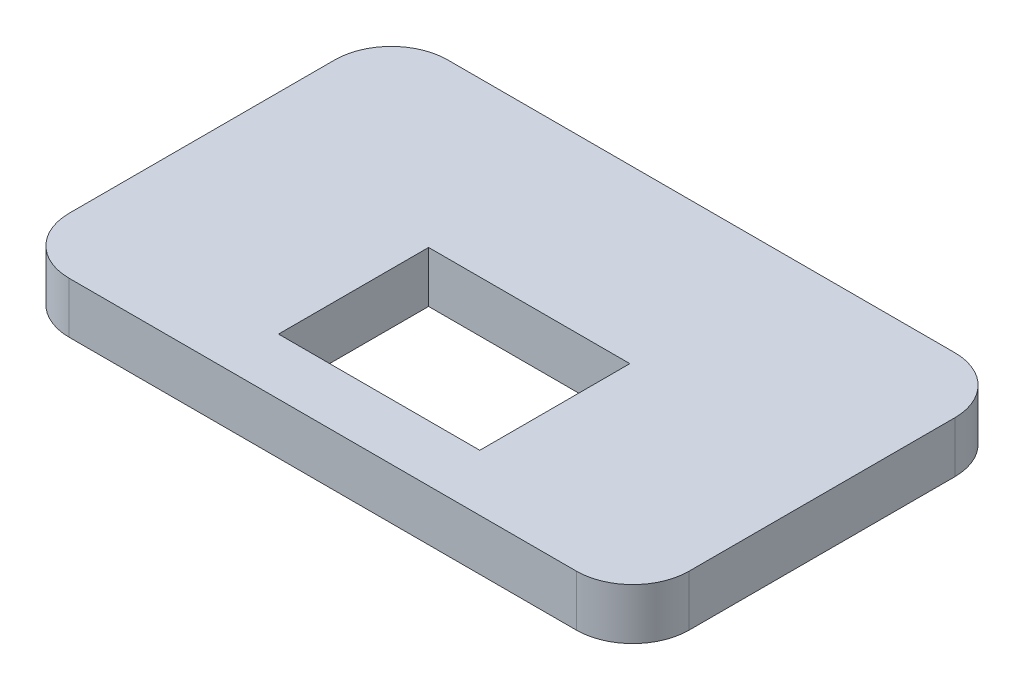
ISO-10303-21;
HEADER;
FILE_DESCRIPTION(('STEP AP214'),'2;1');
FILE_NAME('part.step','',(''),(''),'','','');
FILE_SCHEMA(('AUTOMOTIVE_DESIGN { 1 0 10303 214 1 1 1 1 }'));
ENDSEC;
DATA;
#1=APPLICATION_CONTEXT('core data for automotive mechanical design processes');
#2=APPLICATION_PROTOCOL_DEFINITION('international standard','automotive_design',2000,#1);
#3=PRODUCT_CONTEXT('',#1,'mechanical');
#4=PRODUCT('Part','Part','',(#3));
#5=PRODUCT_RELATED_PRODUCT_CATEGORY('part','',(#4));
#6=PRODUCT_DEFINITION_FORMATION('','',#4);
#7=PRODUCT_DEFINITION_CONTEXT('part definition',#1,'design');
#8=PRODUCT_DEFINITION('design','',#6,#7);
#9=PRODUCT_DEFINITION_SHAPE('','',#8);
#10=(LENGTH_UNIT() NAMED_UNIT(*) SI_UNIT(.MILLI.,.METRE.));
#11=(NAMED_UNIT(*) PLANE_ANGLE_UNIT() SI_UNIT($,.RADIAN.));
#12=(NAMED_UNIT(*) SI_UNIT($,.STERADIAN.) SOLID_ANGLE_UNIT());
#13=UNCERTAINTY_MEASURE_WITH_UNIT(LENGTH_MEASURE(1.E-05),#10,'distance_accuracy_value','');
#14=(GEOMETRIC_REPRESENTATION_CONTEXT(3) GLOBAL_UNCERTAINTY_ASSIGNED_CONTEXT((#13)) GLOBAL_UNIT_ASSIGNED_CONTEXT((#10,
#11,#12)) REPRESENTATION_CONTEXT('',''));
#15=CARTESIAN_POINT('',(0.,0.,0.));
#16=DIRECTION('',(0.,0.,1.));
#17=DIRECTION('',(1.,0.,0.));
#18=AXIS2_PLACEMENT_3D('',#15,#16,#17);
#19=CARTESIAN_POINT('',(7.,6.35,-7.));
#20=DIRECTION('',(0.,-1.,0.));
#21=DIRECTION('',(0.,0.,-1.));
#22=AXIS2_PLACEMENT_3D('',#19,#20,#21);
#23=CYLINDRICAL_SURFACE('',#22,7.);
#24=CARTESIAN_POINT('',(7.,0.,-7.));
#25=DIRECTION('',(0.,1.,0.));
#26=DIRECTION('',(0.,0.,-1.));
#27=AXIS2_PLACEMENT_3D('',#24,#25,#26);
#28=CIRCLE('',#27,7.);
#29=CARTESIAN_POINT('',(0.,0.,-7.00000000000005));
#30=VERTEX_POINT('',#29);
#31=CARTESIAN_POINT('',(7.00000000000005,0.,0.));
#32=VERTEX_POINT('',#31);
#33=EDGE_CURVE('E171',#30,#32,#28,.T.);
#34=ORIENTED_EDGE('',*,*,#33,.T.);
#35=DIRECTION('',(0.,-1.,0.));
#36=VECTOR('',#35,1.);
#37=CARTESIAN_POINT('',(7.00000000000005,6.35,0.));
#38=LINE('',#37,#36);
#39=CARTESIAN_POINT('',(7.00000000000005,6.35,0.));
#40=VERTEX_POINT('',#39);
#41=EDGE_CURVE('E11',#40,#32,#38,.T.);
#42=ORIENTED_EDGE('',*,*,#41,.F.);
#43=CARTESIAN_POINT('',(7.,6.35,-7.));
#44=DIRECTION('',(0.,1.,0.));
#45=DIRECTION('',(0.,0.,-1.));
#46=AXIS2_PLACEMENT_3D('',#43,#44,#45);
#47=CIRCLE('',#46,7.);
#48=CARTESIAN_POINT('',(0.,6.35,-7.00000000000005));
#49=VERTEX_POINT('',#48);
#50=EDGE_CURVE('E177',#49,#40,#47,.T.);
#51=ORIENTED_EDGE('',*,*,#50,.F.);
#52=DIRECTION('',(0.,-1.,0.));
#53=VECTOR('',#52,1.);
#54=CARTESIAN_POINT('',(0.,6.35,-7.00000000000005));
#55=LINE('',#54,#53);
#56=EDGE_CURVE('E203',#49,#30,#55,.T.);
#57=ORIENTED_EDGE('',*,*,#56,.T.);
#58=EDGE_LOOP('',(#34,#42,#51,#57));
#59=FACE_BOUND('',#58,.T.);
#60=ADVANCED_FACE('F39',(#59),#23,.T.);
#61=CARTESIAN_POINT('',(7.00000000000005,6.35,0.));
#62=DIRECTION('',(0.,0.,-1.));
#63=DIRECTION('',(-1.,0.,0.));
#64=AXIS2_PLACEMENT_3D('',#61,#62,#63);
#65=PLANE('',#64);
#66=DIRECTION('',(1.,0.,0.));
#67=VECTOR('',#66,1.);
#68=CARTESIAN_POINT('',(7.00000000000005,0.,0.));
#69=LINE('',#68,#67);
#70=CARTESIAN_POINT('',(70.,0.,0.));
#71=VERTEX_POINT('',#70);
#72=EDGE_CURVE('E207',#32,#71,#69,.T.);
#73=ORIENTED_EDGE('',*,*,#72,.T.);
#74=DIRECTION('',(0.,-1.,0.));
#75=VECTOR('',#74,1.);
#76=CARTESIAN_POINT('',(70.,6.35,0.));
#77=LINE('',#76,#75);
#78=CARTESIAN_POINT('',(70.,6.35,0.));
#79=VERTEX_POINT('',#78);
#80=EDGE_CURVE('E47',#79,#71,#77,.T.);
#81=ORIENTED_EDGE('',*,*,#80,.F.);
#82=DIRECTION('',(1.,0.,0.));
#83=VECTOR('',#82,1.);
#84=CARTESIAN_POINT('',(7.00000000000005,6.35,0.));
#85=LINE('',#84,#83);
#86=EDGE_CURVE('E181',#40,#79,#85,.T.);
#87=ORIENTED_EDGE('',*,*,#86,.F.);
#88=ORIENTED_EDGE('',*,*,#41,.T.);
#89=EDGE_LOOP('',(#73,#81,#87,#88));
#90=FACE_BOUND('',#89,.T.);
#91=ADVANCED_FACE('F276',(#90),#65,.F.);
#92=CARTESIAN_POINT('',(70.,6.35,-7.));
#93=DIRECTION('',(0.,-1.,0.));
#94=DIRECTION('',(0.,0.,-1.));
#95=AXIS2_PLACEMENT_3D('',#92,#93,#94);
#96=CYLINDRICAL_SURFACE('',#95,7.);
#97=CARTESIAN_POINT('',(70.,0.,-7.));
#98=DIRECTION('',(0.,1.,0.));
#99=DIRECTION('',(0.,0.,1.));
#100=AXIS2_PLACEMENT_3D('',#97,#98,#99);
#101=CIRCLE('',#100,7.);
#102=CARTESIAN_POINT('',(77.,0.,-7.00000000000005));
#103=VERTEX_POINT('',#102);
#104=EDGE_CURVE('E210',#71,#103,#101,.T.);
#105=ORIENTED_EDGE('',*,*,#104,.T.);
#106=DIRECTION('',(0.,-1.,0.));
#107=VECTOR('',#106,1.);
#108=CARTESIAN_POINT('',(77.,6.35,-7.00000000000005));
#109=LINE('',#108,#107);
#110=CARTESIAN_POINT('',(77.,6.35,-7.00000000000005));
#111=VERTEX_POINT('',#110);
#112=EDGE_CURVE('E246',#111,#103,#109,.T.);
#113=ORIENTED_EDGE('',*,*,#112,.F.);
#114=CARTESIAN_POINT('',(70.,6.35,-7.));
#115=DIRECTION('',(0.,1.,0.));
#116=DIRECTION('',(0.,0.,1.));
#117=AXIS2_PLACEMENT_3D('',#114,#115,#116);
#118=CIRCLE('',#117,7.);
#119=EDGE_CURVE('E185',#79,#111,#118,.T.);
#120=ORIENTED_EDGE('',*,*,#119,.F.);
#121=ORIENTED_EDGE('',*,*,#80,.T.);
#122=EDGE_LOOP('',(#105,#113,#120,#121));
#123=FACE_BOUND('',#122,.T.);
#124=ADVANCED_FACE('F255',(#123),#96,.T.);
#125=CARTESIAN_POINT('',(77.,6.35,-7.00000000000005));
#126=DIRECTION('',(-1.,0.,0.));
#127=DIRECTION('',(0.,0.,1.));
#128=AXIS2_PLACEMENT_3D('',#125,#126,#127);
#129=PLANE('',#128);
#130=DIRECTION('',(0.,0.,-1.));
#131=VECTOR('',#130,1.);
#132=CARTESIAN_POINT('',(77.,0.,-7.00000000000005));
#133=LINE('',#132,#131);
#134=CARTESIAN_POINT('',(77.,0.,-40.));
#135=VERTEX_POINT('',#134);
#136=EDGE_CURVE('E213',#103,#135,#133,.T.);
#137=ORIENTED_EDGE('',*,*,#136,.T.);
#138=DIRECTION('',(0.,-1.,0.));
#139=VECTOR('',#138,1.);
#140=CARTESIAN_POINT('',(77.,6.35,-40.));
#141=LINE('',#140,#139);
#142=CARTESIAN_POINT('',(77.,6.35,-40.));
#143=VERTEX_POINT('',#142);
#144=EDGE_CURVE('E242',#143,#135,#141,.T.);
#145=ORIENTED_EDGE('',*,*,#144,.F.);
#146=DIRECTION('',(0.,0.,-1.));
#147=VECTOR('',#146,1.);
#148=CARTESIAN_POINT('',(77.,6.35,-7.00000000000005));
#149=LINE('',#148,#147);
#150=EDGE_CURVE('E188',#111,#143,#149,.T.);
#151=ORIENTED_EDGE('',*,*,#150,.F.);
#152=ORIENTED_EDGE('',*,*,#112,.T.);
#153=EDGE_LOOP('',(#137,#145,#151,#152));
#154=FACE_BOUND('',#153,.T.);
#155=ADVANCED_FACE('F264',(#154),#129,.F.);
#156=CARTESIAN_POINT('',(70.,6.35,-40.));
#157=DIRECTION('',(0.,-1.,0.));
#158=DIRECTION('',(0.,0.,-1.));
#159=AXIS2_PLACEMENT_3D('',#156,#157,#158);
#160=CYLINDRICAL_SURFACE('',#159,7.);
#161=CARTESIAN_POINT('',(70.,0.,-40.));
#162=DIRECTION('',(0.,1.,0.));
#163=DIRECTION('',(0.,0.,-1.));
#164=AXIS2_PLACEMENT_3D('',#161,#162,#163);
#165=CIRCLE('',#164,7.);
#166=CARTESIAN_POINT('',(70.,0.,-47.));
#167=VERTEX_POINT('',#166);
#168=EDGE_CURVE('E216',#135,#167,#165,.T.);
#169=ORIENTED_EDGE('',*,*,#168,.T.);
#170=DIRECTION('',(0.,-1.,0.));
#171=VECTOR('',#170,1.);
#172=CARTESIAN_POINT('',(70.,6.35,-47.));
#173=LINE('',#172,#171);
#174=CARTESIAN_POINT('',(70.,6.35,-47.));
#175=VERTEX_POINT('',#174);
#176=EDGE_CURVE('E238',#175,#167,#173,.T.);
#177=ORIENTED_EDGE('',*,*,#176,.F.);
#178=CARTESIAN_POINT('',(70.,6.35,-40.));
#179=DIRECTION('',(0.,1.,0.));
#180=DIRECTION('',(0.,0.,-1.));
#181=AXIS2_PLACEMENT_3D('',#178,#179,#180);
#182=CIRCLE('',#181,7.);
#183=EDGE_CURVE('E191',#143,#175,#182,.T.);
#184=ORIENTED_EDGE('',*,*,#183,.F.);
#185=ORIENTED_EDGE('',*,*,#144,.T.);
#186=EDGE_LOOP('',(#169,#177,#184,#185));
#187=FACE_BOUND('',#186,.T.);
#188=ADVANCED_FACE('F268',(#187),#160,.T.);
#189=CARTESIAN_POINT('',(7.00000000000005,6.35,-47.));
#190=DIRECTION('',(0.,0.,1.));
#191=DIRECTION('',(1.,0.,0.));
#192=AXIS2_PLACEMENT_3D('',#189,#190,#191);
#193=PLANE('',#192);
#194=DIRECTION('',(-1.,0.,0.));
#195=VECTOR('',#194,1.);
#196=CARTESIAN_POINT('',(7.00000000000005,0.,-47.));
#197=LINE('',#196,#195);
#198=CARTESIAN_POINT('',(7.00000000000005,0.,-47.));
#199=VERTEX_POINT('',#198);
#200=EDGE_CURVE('E219',#167,#199,#197,.T.);
#201=ORIENTED_EDGE('',*,*,#200,.T.);
#202=DIRECTION('',(0.,-1.,0.));
#203=VECTOR('',#202,1.);
#204=CARTESIAN_POINT('',(7.00000000000005,6.35,-47.));
#205=LINE('',#204,#203);
#206=CARTESIAN_POINT('',(7.00000000000005,6.35,-47.));
#207=VERTEX_POINT('',#206);
#208=EDGE_CURVE('E234',#207,#199,#205,.T.);
#209=ORIENTED_EDGE('',*,*,#208,.F.);
#210=DIRECTION('',(-1.,0.,0.));
#211=VECTOR('',#210,1.);
#212=CARTESIAN_POINT('',(7.00000000000005,6.35,-47.));
#213=LINE('',#212,#211);
#214=EDGE_CURVE('E194',#175,#207,#213,.T.);
#215=ORIENTED_EDGE('',*,*,#214,.F.);
#216=ORIENTED_EDGE('',*,*,#176,.T.);
#217=EDGE_LOOP('',(#201,#209,#215,#216));
#218=FACE_BOUND('',#217,.T.);
#219=ADVANCED_FACE('F289',(#218),#193,.F.);
#220=CARTESIAN_POINT('',(7.,6.35,-40.));
#221=DIRECTION('',(0.,-1.,0.));
#222=DIRECTION('',(0.,0.,-1.));
#223=AXIS2_PLACEMENT_3D('',#220,#221,#222);
#224=CYLINDRICAL_SURFACE('',#223,7.);
#225=CARTESIAN_POINT('',(7.,0.,-40.));
#226=DIRECTION('',(0.,1.,0.));
#227=DIRECTION('',(0.,0.,-1.));
#228=AXIS2_PLACEMENT_3D('',#225,#226,#227);
#229=CIRCLE('',#228,7.);
#230=CARTESIAN_POINT('',(0.,0.,-40.));
#231=VERTEX_POINT('',#230);
#232=EDGE_CURVE('E222',#199,#231,#229,.T.);
#233=ORIENTED_EDGE('',*,*,#232,.T.);
#234=DIRECTION('',(0.,-1.,0.));
#235=VECTOR('',#234,1.);
#236=CARTESIAN_POINT('',(0.,6.35,-40.));
#237=LINE('',#236,#235);
#238=CARTESIAN_POINT('',(0.,6.35,-40.));
#239=VERTEX_POINT('',#238);
#240=EDGE_CURVE('E230',#239,#231,#237,.T.);
#241=ORIENTED_EDGE('',*,*,#240,.F.);
#242=CARTESIAN_POINT('',(7.,6.35,-40.));
#243=DIRECTION('',(0.,1.,0.));
#244=DIRECTION('',(0.,0.,-1.));
#245=AXIS2_PLACEMENT_3D('',#242,#243,#244);
#246=CIRCLE('',#245,7.);
#247=EDGE_CURVE('E197',#207,#239,#246,.T.);
#248=ORIENTED_EDGE('',*,*,#247,.F.);
#249=ORIENTED_EDGE('',*,*,#208,.T.);
#250=EDGE_LOOP('',(#233,#241,#248,#249));
#251=FACE_BOUND('',#250,.T.);
#252=ADVANCED_FACE('F287',(#251),#224,.T.);
#253=CARTESIAN_POINT('',(0.,6.35,-7.00000000000005));
#254=DIRECTION('',(1.,0.,0.));
#255=DIRECTION('',(0.,0.,-1.));
#256=AXIS2_PLACEMENT_3D('',#253,#254,#255);
#257=PLANE('',#256);
#258=DIRECTION('',(0.,0.,1.));
#259=VECTOR('',#258,1.);
#260=CARTESIAN_POINT('',(0.,0.,-7.00000000000005));
#261=LINE('',#260,#259);
#262=EDGE_CURVE('E182',#231,#30,#261,.T.);
#263=ORIENTED_EDGE('',*,*,#262,.T.);
#264=ORIENTED_EDGE('',*,*,#56,.F.);
#265=DIRECTION('',(0.,0.,1.));
#266=VECTOR('',#265,1.);
#267=CARTESIAN_POINT('',(0.,6.35,-7.00000000000005));
#268=LINE('',#267,#266);
#269=EDGE_CURVE('E200',#239,#49,#268,.T.);
#270=ORIENTED_EDGE('',*,*,#269,.F.);
#271=ORIENTED_EDGE('',*,*,#240,.T.);
#272=EDGE_LOOP('',(#263,#264,#270,#271));
#273=FACE_BOUND('',#272,.T.);
#274=ADVANCED_FACE('F282',(#273),#257,.F.);
#275=CARTESIAN_POINT('',(7.,6.35,-7.));
#276=DIRECTION('',(0.,-1.,0.));
#277=DIRECTION('',(0.,0.,-1.));
#278=AXIS2_PLACEMENT_3D('',#275,#276,#277);
#279=PLANE('',#278);
#280=DIRECTION('',(1.,0.,0.));
#281=VECTOR('',#280,1.);
#282=CARTESIAN_POINT('',(26.,6.35,-7.));
#283=LINE('',#282,#281);
#284=CARTESIAN_POINT('',(26.,6.35,-7.));
#285=VERTEX_POINT('',#284);
#286=CARTESIAN_POINT('',(51.,6.35,-7.));
#287=VERTEX_POINT('',#286);
#288=EDGE_CURVE('E162',#285,#287,#283,.T.);
#289=ORIENTED_EDGE('',*,*,#288,.F.);
#290=DIRECTION('',(0.,0.,1.));
#291=VECTOR('',#290,1.);
#292=CARTESIAN_POINT('',(26.,6.35,-25.64));
#293=LINE('',#292,#291);
#294=CARTESIAN_POINT('',(26.,6.35,-25.64));
#295=VERTEX_POINT('',#294);
#296=EDGE_CURVE('E54',#295,#285,#293,.T.);
#297=ORIENTED_EDGE('',*,*,#296,.F.);
#298=DIRECTION('',(-1.,0.,0.));
#299=VECTOR('',#298,1.);
#300=CARTESIAN_POINT('',(26.,6.35,-25.64));
#301=LINE('',#300,#299);
#302=CARTESIAN_POINT('',(51.,6.35,-25.64));
#303=VERTEX_POINT('',#302);
#304=EDGE_CURVE('E149',#303,#295,#301,.T.);
#305=ORIENTED_EDGE('',*,*,#304,.F.);
#306=DIRECTION('',(0.,0.,-1.));
#307=VECTOR('',#306,1.);
#308=CARTESIAN_POINT('',(51.,6.35,-25.64));
#309=LINE('',#308,#307);
#310=EDGE_CURVE('E153',#287,#303,#309,.T.);
#311=ORIENTED_EDGE('',*,*,#310,.F.);
#312=EDGE_LOOP('',(#289,#297,#305,#311));
#313=FACE_BOUND('',#312,.T.);
#314=ORIENTED_EDGE('',*,*,#50,.T.);
#315=ORIENTED_EDGE('',*,*,#86,.T.);
#316=ORIENTED_EDGE('',*,*,#119,.T.);
#317=ORIENTED_EDGE('',*,*,#150,.T.);
#318=ORIENTED_EDGE('',*,*,#183,.T.);
#319=ORIENTED_EDGE('',*,*,#214,.T.);
#320=ORIENTED_EDGE('',*,*,#247,.T.);
#321=ORIENTED_EDGE('',*,*,#269,.T.);
#322=EDGE_LOOP('',(#314,#315,#316,#317,#318,#319,#320,#321));
#323=FACE_BOUND('',#322,.T.);
#324=ADVANCED_FACE('F272',(#313,#323),#279,.F.);
#325=CARTESIAN_POINT('',(7.,0.,-7.));
#326=DIRECTION('',(0.,-1.,0.));
#327=DIRECTION('',(0.,0.,-1.));
#328=AXIS2_PLACEMENT_3D('',#325,#326,#327);
#329=PLANE('',#328);
#330=DIRECTION('',(0.,0.,1.));
#331=VECTOR('',#330,1.);
#332=CARTESIAN_POINT('',(26.,0.,-25.64));
#333=LINE('',#332,#331);
#334=CARTESIAN_POINT('',(26.,0.,-25.64));
#335=VERTEX_POINT('',#334);
#336=CARTESIAN_POINT('',(26.,0.,-7.));
#337=VERTEX_POINT('',#336);
#338=EDGE_CURVE('E130',#335,#337,#333,.T.);
#339=ORIENTED_EDGE('',*,*,#338,.T.);
#340=DIRECTION('',(1.,0.,0.));
#341=VECTOR('',#340,1.);
#342=CARTESIAN_POINT('',(26.,0.,-7.));
#343=LINE('',#342,#341);
#344=CARTESIAN_POINT('',(51.,0.,-7.00000000000001));
#345=VERTEX_POINT('',#344);
#346=EDGE_CURVE('E140',#337,#345,#343,.T.);
#347=ORIENTED_EDGE('',*,*,#346,.T.);
#348=DIRECTION('',(0.,0.,-1.));
#349=VECTOR('',#348,1.);
#350=CARTESIAN_POINT('',(51.,0.,-25.64));
#351=LINE('',#350,#349);
#352=CARTESIAN_POINT('',(51.,0.,-25.64));
#353=VERTEX_POINT('',#352);
#354=EDGE_CURVE('E62',#345,#353,#351,.T.);
#355=ORIENTED_EDGE('',*,*,#354,.T.);
#356=DIRECTION('',(-1.,0.,0.));
#357=VECTOR('',#356,1.);
#358=CARTESIAN_POINT('',(26.,0.,-25.64));
#359=LINE('',#358,#357);
#360=EDGE_CURVE('E137',#353,#335,#359,.T.);
#361=ORIENTED_EDGE('',*,*,#360,.T.);
#362=EDGE_LOOP('',(#339,#347,#355,#361));
#363=FACE_BOUND('',#362,.T.);
#364=ORIENTED_EDGE('',*,*,#33,.F.);
#365=ORIENTED_EDGE('',*,*,#262,.F.);
#366=ORIENTED_EDGE('',*,*,#232,.F.);
#367=ORIENTED_EDGE('',*,*,#200,.F.);
#368=ORIENTED_EDGE('',*,*,#168,.F.);
#369=ORIENTED_EDGE('',*,*,#136,.F.);
#370=ORIENTED_EDGE('',*,*,#104,.F.);
#371=ORIENTED_EDGE('',*,*,#72,.F.);
#372=EDGE_LOOP('',(#364,#365,#366,#367,#368,#369,#370,#371));
#373=FACE_BOUND('',#372,.T.);
#374=ADVANCED_FACE('F145',(#363,#373),#329,.T.);
#375=CARTESIAN_POINT('',(26.,0.,-25.64));
#376=DIRECTION('',(-1.,0.,0.));
#377=DIRECTION('',(0.,0.,1.));
#378=AXIS2_PLACEMENT_3D('',#375,#376,#377);
#379=PLANE('',#378);
#380=ORIENTED_EDGE('',*,*,#296,.T.);
#381=DIRECTION('',(0.,1.,0.));
#382=VECTOR('',#381,1.);
#383=CARTESIAN_POINT('',(26.,0.,-7.));
#384=LINE('',#383,#382);
#385=EDGE_CURVE('E126',#337,#285,#384,.T.);
#386=ORIENTED_EDGE('',*,*,#385,.F.);
#387=ORIENTED_EDGE('',*,*,#338,.F.);
#388=DIRECTION('',(0.,1.,0.));
#389=VECTOR('',#388,1.);
#390=CARTESIAN_POINT('',(26.,0.,-25.64));
#391=LINE('',#390,#389);
#392=EDGE_CURVE('E168',#335,#295,#391,.T.);
#393=ORIENTED_EDGE('',*,*,#392,.T.);
#394=EDGE_LOOP('',(#380,#386,#387,#393));
#395=FACE_BOUND('',#394,.T.);
#396=ADVANCED_FACE('F128',(#395),#379,.F.);
#397=CARTESIAN_POINT('',(26.,0.,-25.64));
#398=DIRECTION('',(0.,0.,-1.));
#399=DIRECTION('',(-1.,0.,0.));
#400=AXIS2_PLACEMENT_3D('',#397,#398,#399);
#401=PLANE('',#400);
#402=ORIENTED_EDGE('',*,*,#304,.T.);
#403=ORIENTED_EDGE('',*,*,#392,.F.);
#404=ORIENTED_EDGE('',*,*,#360,.F.);
#405=DIRECTION('',(0.,1.,0.));
#406=VECTOR('',#405,1.);
#407=CARTESIAN_POINT('',(51.,0.,-25.64));
#408=LINE('',#407,#406);
#409=EDGE_CURVE('E172',#353,#303,#408,.T.);
#410=ORIENTED_EDGE('',*,*,#409,.T.);
#411=EDGE_LOOP('',(#402,#403,#404,#410));
#412=FACE_BOUND('',#411,.T.);
#413=ADVANCED_FACE('F360',(#412),#401,.F.);
#414=CARTESIAN_POINT('',(51.,0.,-25.64));
#415=DIRECTION('',(1.,0.,0.));
#416=DIRECTION('',(0.,0.,-1.));
#417=AXIS2_PLACEMENT_3D('',#414,#415,#416);
#418=PLANE('',#417);
#419=ORIENTED_EDGE('',*,*,#310,.T.);
#420=ORIENTED_EDGE('',*,*,#409,.F.);
#421=ORIENTED_EDGE('',*,*,#354,.F.);
#422=DIRECTION('',(0.,1.,0.));
#423=VECTOR('',#422,1.);
#424=CARTESIAN_POINT('',(51.,0.,-7.));
#425=LINE('',#424,#423);
#426=EDGE_CURVE('E136',#345,#287,#425,.T.);
#427=ORIENTED_EDGE('',*,*,#426,.T.);
#428=EDGE_LOOP('',(#419,#420,#421,#427));
#429=FACE_BOUND('',#428,.T.);
#430=ADVANCED_FACE('F369',(#429),#418,.F.);
#431=CARTESIAN_POINT('',(26.,0.,-7.));
#432=DIRECTION('',(0.,0.,1.));
#433=DIRECTION('',(1.,0.,0.));
#434=AXIS2_PLACEMENT_3D('',#431,#432,#433);
#435=PLANE('',#434);
#436=ORIENTED_EDGE('',*,*,#288,.T.);
#437=ORIENTED_EDGE('',*,*,#426,.F.);
#438=ORIENTED_EDGE('',*,*,#346,.F.);
#439=ORIENTED_EDGE('',*,*,#385,.T.);
#440=EDGE_LOOP('',(#436,#437,#438,#439));
#441=FACE_BOUND('',#440,.T.);
#442=ADVANCED_FACE('F141',(#441),#435,.F.);
#443=CLOSED_SHELL('',(#60,#91,#124,#155,#188,#219,#252,#274,#324,#374,#396,#413,#430,#442));
#444=MANIFOLD_SOLID_BREP('B2',#443);
#445=ADVANCED_BREP_SHAPE_REPRESENTATION('',(#18,#444),#14);
#446=SHAPE_DEFINITION_REPRESENTATION(#9,#445);
ENDSEC;
END-ISO-10303-21;
